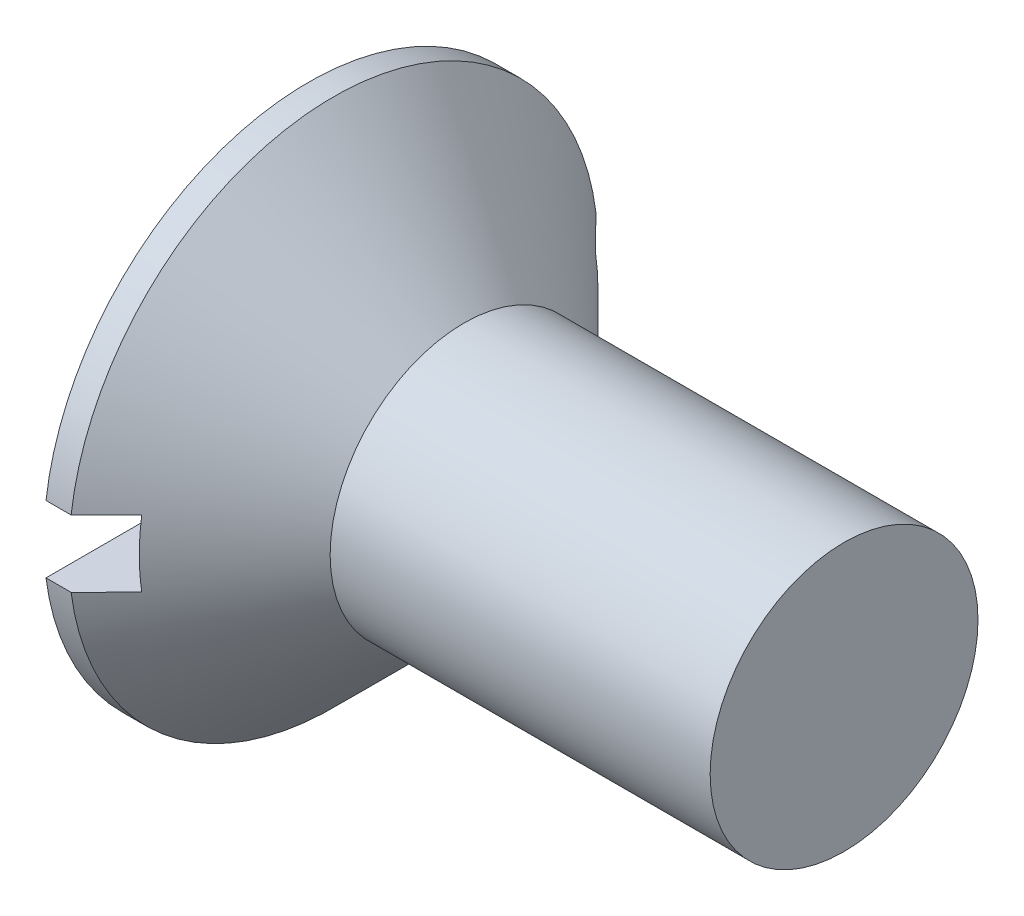
ISO-10303-21;
HEADER;
FILE_DESCRIPTION(('STEP AP214'),'2;1');
FILE_NAME('part.step','',(''),(''),'','','');
FILE_SCHEMA(('AUTOMOTIVE_DESIGN { 1 0 10303 214 1 1 1 1 }'));
ENDSEC;
DATA;
#1=APPLICATION_CONTEXT('core data for automotive mechanical design processes');
#2=APPLICATION_PROTOCOL_DEFINITION('international standard','automotive_design',2000,#1);
#3=PRODUCT_CONTEXT('',#1,'mechanical');
#4=PRODUCT('Part','Part','',(#3));
#5=PRODUCT_RELATED_PRODUCT_CATEGORY('part','',(#4));
#6=PRODUCT_DEFINITION_FORMATION('','',#4);
#7=PRODUCT_DEFINITION_CONTEXT('part definition',#1,'design');
#8=PRODUCT_DEFINITION('design','',#6,#7);
#9=PRODUCT_DEFINITION_SHAPE('','',#8);
#10=(LENGTH_UNIT() NAMED_UNIT(*) SI_UNIT(.MILLI.,.METRE.));
#11=(NAMED_UNIT(*) PLANE_ANGLE_UNIT() SI_UNIT($,.RADIAN.));
#12=(NAMED_UNIT(*) SI_UNIT($,.STERADIAN.) SOLID_ANGLE_UNIT());
#13=UNCERTAINTY_MEASURE_WITH_UNIT(LENGTH_MEASURE(1.E-05),#10,'distance_accuracy_value','');
#14=(GEOMETRIC_REPRESENTATION_CONTEXT(3) GLOBAL_UNCERTAINTY_ASSIGNED_CONTEXT((#13)) GLOBAL_UNIT_ASSIGNED_CONTEXT((#10,
#11,#12)) REPRESENTATION_CONTEXT('',''));
#15=CARTESIAN_POINT('',(0.,0.,0.));
#16=DIRECTION('',(0.,0.,1.));
#17=DIRECTION('',(1.,0.,0.));
#18=AXIS2_PLACEMENT_3D('',#15,#16,#17);
#19=CARTESIAN_POINT('',(0.,0.,0.));
#20=DIRECTION('',(1.,0.,0.));
#21=DIRECTION('',(0.,0.,-1.00000000000001));
#22=AXIS2_PLACEMENT_3D('',#19,#20,#21);
#23=PLANE('',#22);
#24=CARTESIAN_POINT('',(0.,0.,0.));
#25=DIRECTION('',(-1.,0.,0.));
#26=DIRECTION('',(0.,0.,1.00000000000001));
#27=AXIS2_PLACEMENT_3D('',#24,#25,#26);
#28=CIRCLE('',#27,7.9);
#29=CARTESIAN_POINT('',(1.07552855510562E-13,0.999999999999845,7.83645327938635));
#30=VERTEX_POINT('',#29);
#31=CARTESIAN_POINT('',(0.,0.99999999999999,-7.83645327938601));
#32=VERTEX_POINT('',#31);
#33=EDGE_CURVE('E122',#30,#32,#28,.T.);
#34=ORIENTED_EDGE('',*,*,#33,.T.);
#35=DIRECTION('',(0.,0.,1.00000000000001));
#36=VECTOR('',#35,1.);
#37=CARTESIAN_POINT('',(0.,0.999999999999925,1.31838984174237E-13));
#38=LINE('',#37,#36);
#39=EDGE_CURVE('E140',#32,#30,#38,.T.);
#40=ORIENTED_EDGE('',*,*,#39,.T.);
#41=EDGE_LOOP('',(#34,#40));
#42=FACE_BOUND('',#41,.T.);
#43=ADVANCED_FACE('F36',(#42),#23,.F.);
#44=CARTESIAN_POINT('',(-3.22858157710809,0.,0.));
#45=DIRECTION('',(-1.,0.,0.));
#46=DIRECTION('',(0.,0.,1.00000000000001));
#47=AXIS2_PLACEMENT_3D('',#44,#45,#46);
#48=CYLINDRICAL_SURFACE('',#47,7.9);
#49=CARTESIAN_POINT('',(0.750000000000001,0.,0.));
#50=DIRECTION('',(-1.,0.,0.));
#51=DIRECTION('',(0.,0.,1.00000000000001));
#52=AXIS2_PLACEMENT_3D('',#49,#50,#51);
#53=CIRCLE('',#52,7.9);
#54=CARTESIAN_POINT('',(0.74999999999999,-1.00000000000001,-7.83645327938595));
#55=VERTEX_POINT('',#54);
#56=CARTESIAN_POINT('',(0.750000000000108,-1.00000000000002,7.83645327938614));
#57=VERTEX_POINT('',#56);
#58=EDGE_CURVE('E114',#55,#57,#53,.T.);
#59=ORIENTED_EDGE('',*,*,#58,.T.);
#60=DIRECTION('',(-1.,0.,0.));
#61=VECTOR('',#60,1.);
#62=CARTESIAN_POINT('',(-3.22858157710808,-1.00000000000008,7.83645327938615));
#63=LINE('',#62,#61);
#64=CARTESIAN_POINT('',(1.07552855510562E-13,-1.00000000000002,7.83645327938614));
#65=VERTEX_POINT('',#64);
#66=EDGE_CURVE('E58',#57,#65,#63,.T.);
#67=ORIENTED_EDGE('',*,*,#66,.T.);
#68=CARTESIAN_POINT('',(0.,-1.00000000000001,-7.83645327938595));
#69=VERTEX_POINT('',#68);
#70=EDGE_CURVE('E124',#69,#65,#28,.T.);
#71=ORIENTED_EDGE('',*,*,#70,.F.);
#72=DIRECTION('',(-1.,0.,0.));
#73=VECTOR('',#72,1.);
#74=CARTESIAN_POINT('',(-3.2285815771081,-1.00000000000002,-7.83645327938595));
#75=LINE('',#74,#73);
#76=EDGE_CURVE('E145',#69,#55,#75,.F.);
#77=ORIENTED_EDGE('',*,*,#76,.T.);
#78=EDGE_LOOP('',(#59,#67,#71,#77));
#79=FACE_BOUND('',#78,.T.);
#80=ADVANCED_FACE('F157',(#79),#48,.T.);
#81=ORIENTED_EDGE('',*,*,#70,.T.);
#82=DIRECTION('',(0.,0.,-1.00000000000001));
#83=VECTOR('',#82,1.);
#84=CARTESIAN_POINT('',(1.07552855510562E-13,-1.,1.66533453693773E-13));
#85=LINE('',#84,#83);
#86=EDGE_CURVE('E147',#65,#69,#85,.T.);
#87=ORIENTED_EDGE('',*,*,#86,.T.);
#88=EDGE_LOOP('',(#81,#87));
#89=FACE_BOUND('',#88,.T.);
#90=ADVANCED_FACE('F38',(#89),#23,.F.);
#91=CARTESIAN_POINT('',(0.750000000000108,0.999999999999845,7.83645327938635));
#92=VERTEX_POINT('',#91);
#93=CARTESIAN_POINT('',(0.74999999999999,0.99999999999999,-7.83645327938601));
#94=VERTEX_POINT('',#93);
#95=EDGE_CURVE('E129',#92,#94,#53,.T.);
#96=ORIENTED_EDGE('',*,*,#95,.T.);
#97=DIRECTION('',(-1.,0.,0.));
#98=VECTOR('',#97,1.);
#99=CARTESIAN_POINT('',(-3.2285815771081,0.99999999999999,-7.83645327938601));
#100=LINE('',#99,#98);
#101=EDGE_CURVE('E142',#94,#32,#100,.T.);
#102=ORIENTED_EDGE('',*,*,#101,.T.);
#103=ORIENTED_EDGE('',*,*,#33,.F.);
#104=DIRECTION('',(-1.,0.,0.));
#105=VECTOR('',#104,1.);
#106=CARTESIAN_POINT('',(-3.22858157710798,0.999999999999921,7.83645327938636));
#107=LINE('',#106,#105);
#108=EDGE_CURVE('E138',#30,#92,#107,.F.);
#109=ORIENTED_EDGE('',*,*,#108,.T.);
#110=EDGE_LOOP('',(#96,#102,#103,#109));
#111=FACE_BOUND('',#110,.T.);
#112=ADVANCED_FACE('F155',(#111),#48,.T.);
#113=CARTESIAN_POINT('',(4.65,0.,0.));
#114=DIRECTION('',(-1.,0.,0.));
#115=DIRECTION('',(0.,0.,1.00000000000001));
#116=AXIS2_PLACEMENT_3D('',#113,#114,#115);
#117=CONICAL_SURFACE('',#116,4.,0.785398163397448);
#118=CARTESIAN_POINT('',(1.8,0.,0.));
#119=DIRECTION('',(1.,0.,0.));
#120=DIRECTION('',(0.,1.00000000000002,0.));
#121=AXIS2_PLACEMENT_3D('',#118,#119,#120);
#122=CIRCLE('',#121,6.85);
#123=CARTESIAN_POINT('',(1.8,-1.,-6.77661419884587));
#124=VERTEX_POINT('',#123);
#125=CARTESIAN_POINT('',(1.8,1.00000000000002,-6.77661419884588));
#126=VERTEX_POINT('',#125);
#127=EDGE_CURVE('E51',#124,#126,#122,.T.);
#128=ORIENTED_EDGE('',*,*,#127,.T.);
#129=CARTESIAN_POINT('',(-8.75111048268514,0.99999999999999,17.3723529215428));
#130=CARTESIAN_POINT('',(-8.16144224495191,0.99999999999999,16.7817012338804));
#131=CARTESIAN_POINT('',(-7.57181679409338,0.999999999999989,16.1910068100643));
#132=CARTESIAN_POINT('',(-6.39269800938796,0.999999999999988,15.0094721269609));
#133=CARTESIAN_POINT('',(-5.80320467719195,0.999999999999987,14.4186318660262));
#134=CARTESIAN_POINT('',(-4.62425427261055,0.999999999999987,13.2366023548547));
#135=CARTESIAN_POINT('',(-4.03479725135443,0.999999999999986,12.6454130536151));
#136=CARTESIAN_POINT('',(-2.85618266385658,0.999999999999985,11.4627496565458));
#137=CARTESIAN_POINT('',(-2.26702509422704,0.999999999999984,10.8712755640925));
#138=CARTESIAN_POINT('',(-1.06840913198528,0.999999999999983,9.66700955329708));
#139=CARTESIAN_POINT('',(-0.458967260785589,0.999999999999983,9.05420118301458));
#140=CARTESIAN_POINT('',(0.454532222825595,0.999999999999982,8.1343077388035));
#141=CARTESIAN_POINT('',(0.758927003110809,0.999999999999981,7.82755754816286));
#142=CARTESIAN_POINT('',(1.36739261118857,0.999999999999981,7.21373815557743));
#143=CARTESIAN_POINT('',(1.67146344012798,0.999999999999981,6.90666895476967));
#144=CARTESIAN_POINT('',(2.27908236392702,0.99999999999998,6.2921161152463));
#145=CARTESIAN_POINT('',(2.58263053845717,0.999999999999979,5.98463255535697));
#146=CARTESIAN_POINT('',(3.18899261007889,0.99999999999998,5.36893396929874));
#147=CARTESIAN_POINT('',(3.49180649709191,0.999999999999983,5.06071893320347));
#148=CARTESIAN_POINT('',(4.09619822396069,0.999999999999974,4.44311462398919));
#149=CARTESIAN_POINT('',(4.39777614184049,0.999999999999962,4.13372542744331));
#150=CARTESIAN_POINT('',(4.84838109277027,0.999999999999985,3.66794267828143));
#151=CARTESIAN_POINT('',(4.99828746848486,1.,3.51240030320817));
#152=CARTESIAN_POINT('',(5.2972295071079,0.999999999999955,3.20048152496961));
#153=CARTESIAN_POINT('',(5.44626517758961,0.999999999999895,3.04410512908119));
#154=CARTESIAN_POINT('',(5.63452019031248,0.99999999999995,2.84487341796281));
#155=CARTESIAN_POINT('',(5.67436438858135,0.999999999999969,2.80260845226597));
#156=CARTESIAN_POINT('',(5.7539398914092,0.999999999999984,2.71797219006638));
#157=CARTESIAN_POINT('',(5.79367119571338,0.999999999999979,2.67560089332404));
#158=CARTESIAN_POINT('',(5.91267399890453,0.999999999999971,2.54830598388808));
#159=CARTESIAN_POINT('',(5.99175330410761,0.999999999999972,2.46320249752469));
#160=CARTESIAN_POINT('',(6.1489582397943,0.999999999999981,2.29266307557925));
#161=CARTESIAN_POINT('',(6.22708622766774,0.999999999999988,2.20722931905867));
#162=CARTESIAN_POINT('',(6.38240183057305,0.999999999999964,2.03551770123204));
#163=CARTESIAN_POINT('',(6.45958947879937,0.999999999999932,1.94923986991724));
#164=CARTESIAN_POINT('',(6.6386237698956,0.999999999999914,1.74605972009377));
#165=CARTESIAN_POINT('',(6.73995381200676,0.999999999999947,1.62869639305075));
#166=CARTESIAN_POINT('',(6.88917519252372,0.99999999999999,1.44968131693157));
#167=CARTESIAN_POINT('',(6.938606899626,1.,1.3893168346165));
#168=CARTESIAN_POINT('',(7.03600057631057,0.999999999999948,1.26741714506481));
#169=CARTESIAN_POINT('',(7.08396269678783,0.999999999999879,1.20588205908281));
#170=CARTESIAN_POINT('',(7.1784042551802,0.999999999999879,1.08042827136698));
#171=CARTESIAN_POINT('',(7.22485668078559,0.999999999999949,1.01648908913458));
#172=CARTESIAN_POINT('',(7.31461514560344,1.,0.886276219999968));
#173=CARTESIAN_POINT('',(7.35791688740962,0.999999999999982,0.819999521100189));
#174=CARTESIAN_POINT('',(7.43909029004803,0.999999999999967,0.684983207333312));
#175=CARTESIAN_POINT('',(7.47700827738964,0.999999999999971,0.616271888635362));
#176=CARTESIAN_POINT('',(7.5446644467034,0.999999999999978,0.47495464455035));
#177=CARTESIAN_POINT('',(7.57442800697369,0.999999999999982,0.402361662506173));
#178=CARTESIAN_POINT('',(7.60828605986784,0.999999999999979,0.293622142922142));
#179=CARTESIAN_POINT('',(7.61754278768115,0.999999999999977,0.25909114505043));
#180=CARTESIAN_POINT('',(7.63280808195745,0.999999999999971,0.189307737917459));
#181=CARTESIAN_POINT('',(7.63881713950401,0.999999999999968,0.15405543856209));
#182=CARTESIAN_POINT('',(7.64714790586476,0.999999999999979,0.0832984083006169));
#183=CARTESIAN_POINT('',(7.64948896554468,0.999999999999993,0.0477960014965256));
#184=CARTESIAN_POINT('',(7.65036050339176,0.999999999999954,-0.0232573195438609));
#185=CARTESIAN_POINT('',(7.64889094055609,0.9999999999999,-0.0588082342979944));
#186=CARTESIAN_POINT('',(7.64227381399178,0.999999999999901,-0.129391283773637));
#187=CARTESIAN_POINT('',(7.63714337869394,0.999999999999954,-0.164425061814244));
#188=CARTESIAN_POINT('',(7.62358602557578,0.999999999999992,-0.23385193271585));
#189=CARTESIAN_POINT('',(7.61515765736175,0.999999999999976,-0.26824473670217));
#190=CARTESIAN_POINT('',(7.59543017486798,0.99999999999997,-0.336439707723722));
#191=CARTESIAN_POINT('',(7.58411176460614,0.999999999999979,-0.370236204747931));
#192=CARTESIAN_POINT('',(7.55914708298644,0.999999999999967,-0.436939365687489));
#193=CARTESIAN_POINT('',(7.54550116225841,0.999999999999945,-0.469846162768686));
#194=CARTESIAN_POINT('',(7.50536219669924,0.999999999999927,-0.559280194075011));
#195=CARTESIAN_POINT('',(7.47693282128606,0.99999999999996,-0.614934514191874));
#196=CARTESIAN_POINT('',(7.41619685900515,0.999999999999985,-0.724104222688096));
#197=CARTESIAN_POINT('',(7.3838860325856,0.999999999999975,-0.777617185554004));
#198=CARTESIAN_POINT('',(7.31649651100038,0.999999999999969,-0.883108836541741));
#199=CARTESIAN_POINT('',(7.28140888252926,0.999999999999971,-0.935081766813651));
#200=CARTESIAN_POINT('',(7.20934259617385,0.999999999999973,-1.03770237134481));
#201=CARTESIAN_POINT('',(7.1723635731699,0.999999999999972,-1.08834978684895));
#202=CARTESIAN_POINT('',(7.09668756377589,0.999999999999971,-1.18907223755568));
#203=CARTESIAN_POINT('',(7.05797787678311,0.999999999999971,-1.23913768340023));
#204=CARTESIAN_POINT('',(6.97951546547231,0.999999999999971,-1.33844833687462));
#205=CARTESIAN_POINT('',(6.93976264948154,0.999999999999972,-1.3876934717876));
#206=CARTESIAN_POINT('',(6.85955804419442,0.99999999999997,-1.48541557793774));
#207=CARTESIAN_POINT('',(6.81910812141697,0.999999999999967,-1.53389408506544));
#208=CARTESIAN_POINT('',(6.73759257566203,0.999999999999974,-1.63032614618768));
#209=CARTESIAN_POINT('',(6.69652697774345,0.999999999999984,-1.67827972141103));
#210=CARTESIAN_POINT('',(6.57434405385389,0.999999999999994,-1.81949375555138));
#211=CARTESIAN_POINT('',(6.49253777102532,0.999999999999976,-1.91215770302953));
#212=CARTESIAN_POINT('',(6.32768810256273,0.999999999999963,-2.09638021295081));
#213=CARTESIAN_POINT('',(6.24464466214777,0.999999999999967,-2.18793872611874));
#214=CARTESIAN_POINT('',(6.07767736659286,0.999999999999971,-2.370271227974));
#215=CARTESIAN_POINT('',(5.99375339367504,0.999999999999969,-2.46104510867123));
#216=CARTESIAN_POINT('',(5.8252708659291,0.999999999999968,-2.64200251669864));
#217=CARTESIAN_POINT('',(5.74071230551223,0.999999999999968,-2.73218603881647));
#218=CARTESIAN_POINT('',(5.4861316388928,0.999999999999968,-3.00228581399741));
#219=CARTESIAN_POINT('',(5.31540328584025,0.999999999999967,-3.18153596104206));
#220=CARTESIAN_POINT('',(4.97283523027718,0.999999999999966,-3.5389401467443));
#221=CARTESIAN_POINT('',(4.80099561775687,0.999999999999966,-3.71709427193361));
#222=CARTESIAN_POINT('',(4.45832154023981,0.999999999999965,-4.07088240821385));
#223=CARTESIAN_POINT('',(4.28749454529666,0.999999999999965,-4.24652365827113));
#224=CARTESIAN_POINT('',(3.94533540474472,0.999999999999963,-4.5973201166138));
#225=CARTESIAN_POINT('',(3.77400324873452,0.999999999999962,-4.77247531474503));
#226=CARTESIAN_POINT('',(3.25964190551176,0.999999999999966,-5.29724637133376));
#227=CARTESIAN_POINT('',(2.91608021829216,0.999999999999981,-5.64634010483317));
#228=CARTESIAN_POINT('',(2.1068567584288,0.999999999999987,-6.4667381225843));
#229=CARTESIAN_POINT('',(1.64086835816068,0.999999999999966,-6.93771982623414));
#230=CARTESIAN_POINT('',(0.708118272101816,0.999999999999949,-7.8789194952222));
#231=CARTESIAN_POINT('',(0.241356583769341,0.999999999999954,-8.34913745803997));
#232=CARTESIAN_POINT('',(-0.692730625460433,0.999999999999955,-9.28920941360574));
#233=CARTESIAN_POINT('',(-1.16005624428106,0.999999999999953,-9.75906330902656));
#234=CARTESIAN_POINT('',(-2.09500849239945,0.99999999999995,-10.6984704213426));
#235=CARTESIAN_POINT('',(-2.56263512136168,0.999999999999949,-11.1680236385718));
#236=CARTESIAN_POINT('',(-3.98334366363007,0.999999999999947,-12.593974439585));
#237=CARTESIAN_POINT('',(-4.9367424196597,0.999999999999946,-13.5500563183113));
#238=CARTESIAN_POINT('',(-6.36705466579657,0.999999999999939,-14.9837557450105));
#239=CARTESIAN_POINT('',(-6.84380866332769,0.999999999999936,-15.4615324747223));
#240=CARTESIAN_POINT('',(-7.79740134857238,0.999999999999941,-16.4170010082393));
#241=CARTESIAN_POINT('',(-8.27424003625006,0.999999999999951,-16.8946928120804));
#242=CARTESIAN_POINT('',(-8.7511104826849,0.999999999999973,-17.3723529215423));
#243=B_SPLINE_CURVE_WITH_KNOTS('',3,(#129,#130,#131,#132,#133,#134,#135,#136,#137,#138,#139,
#140,#141,#142,#143,#144,#145,#146,#147,#148,#149,#150,#151,#152,#153,#154,#155,#156,#157,#158,
#159,#160,#161,#162,#163,#164,#165,#166,#167,#168,#169,#170,#171,#172,#173,#174,#175,#176,#177,
#178,#179,#180,#181,#182,#183,#184,#185,#186,#187,#188,#189,#190,#191,#192,#193,#194,#195,#196,
#197,#198,#199,#200,#201,#202,#203,#204,#205,#206,#207,#208,#209,#210,#211,#212,#213,#214,#215,
#216,#217,#218,#219,#220,#221,#222,#223,#224,#225,#226,#227,#228,#229,#230,#231,#232,#233,#234,
#235,#236,#237,#238,#239,#240,#241,#242),.UNSPECIFIED.,.F.,.F.,(4,2,2,2,2,2,2,2,2,2,2,2,2,2,2,2,
2,2,2,2,2,2,2,2,2,2,2,2,2,2,2,2,2,2,2,2,2,2,2,2,2,2,2,2,2,2,2,2,2,2,2,2,2,2,2,2,4),(0.,
2.50383755724038,5.00770482803633,7.51223650824819,10.0167391934141,12.6095327120228,
13.9059764267842,15.2024155365041,16.4986355078513,17.794873171067,19.0910277047169,
19.7390908795515,20.3871484092153,20.5614037586538,20.7356595010722,21.0841757171254,
21.4314823024859,21.7787765920226,22.2438728574652,22.4779222223597,22.7119474743278,
22.9489834157771,23.1863368287491,23.4215048062615,23.6559323555037,23.7630547362442,
23.8701609143635,23.9767001180704,24.0832404681586,24.1892855801903,24.2953773821798,
24.4021969469652,24.5090004340141,24.6962296363362,24.883665233442,25.0717304703324,
25.2598321498577,25.4496689454166,25.6395224805462,25.8289289177426,26.0183276666284,
26.3891315344037,26.7599518703444,27.1308224551965,27.501696310109,28.2443230112183,
28.9868903089778,29.7219298404617,30.4569846138102,31.9263727667959,33.9140132618934,
35.9016603032082,37.8897253054991,39.8777880955948,43.9284118600559,45.9532784749723,
47.9781442336095),.UNSPECIFIED.);
#244=EDGE_CURVE('E11',#126,#94,#243,.T.);
#245=ORIENTED_EDGE('',*,*,#244,.T.);
#246=ORIENTED_EDGE('',*,*,#95,.F.);
#247=CARTESIAN_POINT('',(1.8000000000001,0.999999999999942,6.77661419884607));
#248=VERTEX_POINT('',#247);
#249=EDGE_CURVE('E40',#92,#248,#243,.T.);
#250=ORIENTED_EDGE('',*,*,#249,.T.);
#251=CARTESIAN_POINT('',(1.8000000000001,-1.00000000000001,6.77661419884592));
#252=VERTEX_POINT('',#251);
#253=EDGE_CURVE('E105',#248,#252,#122,.T.);
#254=ORIENTED_EDGE('',*,*,#253,.T.);
#255=CARTESIAN_POINT('',(-8.75111048268492,-1.00000000000004,-17.3723529215423));
#256=CARTESIAN_POINT('',(-8.16144224495161,-1.00000000000004,-16.78170123388));
#257=CARTESIAN_POINT('',(-7.57181679409306,-1.00000000000004,-16.1910068100639));
#258=CARTESIAN_POINT('',(-6.39269800938762,-1.00000000000004,-15.0094721269606));
#259=CARTESIAN_POINT('',(-5.80320467719163,-1.00000000000004,-14.4186318660258));
#260=CARTESIAN_POINT('',(-4.62425427261024,-1.00000000000003,-13.2366023548544));
#261=CARTESIAN_POINT('',(-4.03479725135414,-1.00000000000003,-12.6454130536147));
#262=CARTESIAN_POINT('',(-2.8561826638563,-1.00000000000003,-11.4627496565455));
#263=CARTESIAN_POINT('',(-2.26702509422677,-1.00000000000003,-10.8712755640922));
#264=CARTESIAN_POINT('',(-1.06840913198503,-1.00000000000002,-9.66700955329682));
#265=CARTESIAN_POINT('',(-0.458967260785346,-1.00000000000002,-9.05420118301433));
#266=CARTESIAN_POINT('',(0.454532222825824,-1.00000000000002,-8.13430773880327));
#267=CARTESIAN_POINT('',(0.758927003111032,-1.00000000000002,-7.82755754816263));
#268=CARTESIAN_POINT('',(1.36739261118878,-1.00000000000002,-7.21373815557721));
#269=CARTESIAN_POINT('',(1.67146344012819,-1.00000000000002,-6.90666895476945));
#270=CARTESIAN_POINT('',(2.27908236392722,-1.00000000000002,-6.2921161152461));
#271=CARTESIAN_POINT('',(2.58263053845736,-1.00000000000002,-5.98463255535677));
#272=CARTESIAN_POINT('',(3.18899261007909,-1.00000000000001,-5.36893396929855));
#273=CARTESIAN_POINT('',(3.4918064970921,-1.00000000000001,-5.06071893320329));
#274=CARTESIAN_POINT('',(4.09619822396086,-1.00000000000002,-4.443114623989));
#275=CARTESIAN_POINT('',(4.39777614184064,-1.00000000000003,-4.1337254274431));
#276=CARTESIAN_POINT('',(4.84838109277046,-1.,-3.66794267828127));
#277=CARTESIAN_POINT('',(4.99828746848507,-0.999999999999984,-3.51240030320803));
#278=CARTESIAN_POINT('',(5.29722950710803,-1.00000000000004,-3.2004815249694));
#279=CARTESIAN_POINT('',(5.44626517758964,-1.00000000000011,-3.04410512908088));
#280=CARTESIAN_POINT('',(5.6345201903126,-1.00000000000004,-2.84487341796259));
#281=CARTESIAN_POINT('',(5.6743643885815,-1.00000000000002,-2.80260845226579));
#282=CARTESIAN_POINT('',(5.75393989140938,-1.,-2.71797219006622));
#283=CARTESIAN_POINT('',(5.79367119571355,-1.00000000000001,-2.67560089332387));
#284=CARTESIAN_POINT('',(5.91267399890469,-1.00000000000002,-2.54830598388789));
#285=CARTESIAN_POINT('',(5.99175330410777,-1.00000000000001,-2.46320249752451));
#286=CARTESIAN_POINT('',(6.14895823979448,-1.,-2.29266307557907));
#287=CARTESIAN_POINT('',(6.22708622766793,-1.,-2.2072293190585));
#288=CARTESIAN_POINT('',(6.3824018305732,-1.00000000000002,-2.03551770123184));
#289=CARTESIAN_POINT('',(6.45958947879948,-1.00000000000004,-1.949239869917));
#290=CARTESIAN_POINT('',(6.6386237698957,-1.00000000000005,-1.7460597200935));
#291=CARTESIAN_POINT('',(6.73995381200691,-1.00000000000003,-1.62869639305053));
#292=CARTESIAN_POINT('',(6.88917519252391,-0.999999999999997,-1.44968131693138));
#293=CARTESIAN_POINT('',(6.93860689962619,-0.999999999999988,-1.3893168346163));
#294=CARTESIAN_POINT('',(7.03600057631072,-1.00000000000002,-1.26741714506458));
#295=CARTESIAN_POINT('',(7.08396269678793,-1.00000000000007,-1.20588205908254));
#296=CARTESIAN_POINT('',(7.1784042551803,-1.00000000000007,-1.0804282713667));
#297=CARTESIAN_POINT('',(7.22485668078574,-1.00000000000002,-1.01648908913433));
#298=CARTESIAN_POINT('',(7.31461514560363,-0.999999999999992,-0.886276219999729));
#299=CARTESIAN_POINT('',(7.35791688740979,-1.00000000000001,-0.819999521099931));
#300=CARTESIAN_POINT('',(7.43909029004818,-0.999999999999997,-0.684983207333023));
#301=CARTESIAN_POINT('',(7.47700827738979,-0.99999999999996,-0.616271888635062));
#302=CARTESIAN_POINT('',(7.54466444670354,-1.00000000000005,-0.474954644550029));
#303=CARTESIAN_POINT('',(7.57442800697383,-1.00000000000018,-0.402361662505845));
#304=CARTESIAN_POINT('',(7.60828605986793,-1.00000000000009,-0.293622142921814));
#305=CARTESIAN_POINT('',(7.61754278768122,-1.00000000000003,-0.259091145050115));
#306=CARTESIAN_POINT('',(7.63280808195749,-0.999999999999981,-0.189307737917167));
#307=CARTESIAN_POINT('',(7.63881713950405,-0.999999999999999,-0.154055438561809));
#308=CARTESIAN_POINT('',(7.64714790586476,-1.00000000000001,-0.0832984083003596));
#309=CARTESIAN_POINT('',(7.64948896554465,-1.,-0.0477960014962827));
#310=CARTESIAN_POINT('',(7.65036050339178,-1.00000000000001,0.0232573195440767));
#311=CARTESIAN_POINT('',(7.6488909405562,-1.00000000000002,0.0588082342981973));
#312=CARTESIAN_POINT('',(7.64227381399188,-1.00000000000002,0.129391283773811));
#313=CARTESIAN_POINT('',(7.63714337869393,-1.00000000000001,0.164425061814402));
#314=CARTESIAN_POINT('',(7.6235860255757,-0.999999999999998,0.233851932715996));
#315=CARTESIAN_POINT('',(7.6151576573617,-1.,0.268244736702319));
#316=CARTESIAN_POINT('',(7.59543017486792,-1.00000000000001,0.336439707723864));
#317=CARTESIAN_POINT('',(7.58411176460604,-1.00000000000001,0.37023620474806));
#318=CARTESIAN_POINT('',(7.5591470829864,-0.999999999999999,0.436939365687644));
#319=CARTESIAN_POINT('',(7.54550116225848,-0.99999999999999,0.46984616276888));
#320=CARTESIAN_POINT('',(7.50536219669941,-0.999999999999982,0.559280194075215));
#321=CARTESIAN_POINT('',(7.47693282128606,-0.999999999999997,0.61493451419198));
#322=CARTESIAN_POINT('',(7.41619685900503,-1.00000000000001,0.724104222688119));
#323=CARTESIAN_POINT('',(7.38388603258553,-1.,0.777617185554041));
#324=CARTESIAN_POINT('',(7.31649651100035,-1.,0.883108836541787));
#325=CARTESIAN_POINT('',(7.28140888252922,-1.,0.935081766813691));
#326=CARTESIAN_POINT('',(7.2093425961738,-1.,1.03770237134485));
#327=CARTESIAN_POINT('',(7.17236357316984,-1.,1.08834978684899));
#328=CARTESIAN_POINT('',(7.09668756377584,-1.,1.18907223755572));
#329=CARTESIAN_POINT('',(7.05797787678306,-1.,1.23913768340027));
#330=CARTESIAN_POINT('',(6.97951546547225,-1.,1.33844833687467));
#331=CARTESIAN_POINT('',(6.93976264948149,-1.,1.38769347178765));
#332=CARTESIAN_POINT('',(6.85955804419436,-1.,1.48541557793777));
#333=CARTESIAN_POINT('',(6.81910812141689,-1.,1.53389408506545));
#334=CARTESIAN_POINT('',(6.73759257566202,-1.,1.63032614618772));
#335=CARTESIAN_POINT('',(6.69652697774352,-0.999999999999996,1.67827972141113));
#336=CARTESIAN_POINT('',(6.57434405385404,-0.999999999999991,1.81949375555154));
#337=CARTESIAN_POINT('',(6.49253777102535,-0.999999999999999,1.91215770302957));
#338=CARTESIAN_POINT('',(6.32768810256266,-1.,2.09638021295077));
#339=CARTESIAN_POINT('',(6.24464466214774,-1.,2.18793872611872));
#340=CARTESIAN_POINT('',(6.07767736659286,-1.,2.37027122797401));
#341=CARTESIAN_POINT('',(5.99375339367503,-1.,2.46104510867122));
#342=CARTESIAN_POINT('',(5.82527086592908,-1.,2.64200251669863));
#343=CARTESIAN_POINT('',(5.74071230551221,-1.,2.73218603881647));
#344=CARTESIAN_POINT('',(5.48613163889278,-1.,3.00228581399742));
#345=CARTESIAN_POINT('',(5.31540328584022,-1.,3.18153596104207));
#346=CARTESIAN_POINT('',(4.97283523027713,-1.,3.53894014674433));
#347=CARTESIAN_POINT('',(4.80099561775681,-1.,3.71709427193365));
#348=CARTESIAN_POINT('',(4.45832154023974,-1.,4.0708824082139));
#349=CARTESIAN_POINT('',(4.28749454529659,-1.,4.2465236582712));
#350=CARTESIAN_POINT('',(3.94533540474463,-0.999999999999997,4.59732011661386));
#351=CARTESIAN_POINT('',(3.77400324873441,-0.999999999999993,4.77247531474509));
#352=CARTESIAN_POINT('',(3.25964190551169,-1.00000000000001,5.29724637133389));
#353=CARTESIAN_POINT('',(2.91608021829223,-1.00000000000006,5.64634010483343));
#354=CARTESIAN_POINT('',(2.10685675842891,-1.00000000000008,6.46673812258466));
#355=CARTESIAN_POINT('',(1.6408683581606,-1.00000000000002,6.93771982623434));
#356=CARTESIAN_POINT('',(0.708118272101569,-0.999999999999973,7.87891949522232));
#357=CARTESIAN_POINT('',(0.241356583769123,-0.999999999999989,8.34913745804016));
#358=CARTESIAN_POINT('',(-0.692730625460661,-1.,9.289209413606));
#359=CARTESIAN_POINT('',(-1.16005624428132,-0.999999999999996,9.75906330902684));
#360=CARTESIAN_POINT('',(-2.09500849239977,-0.999999999999991,10.6984704213429));
#361=CARTESIAN_POINT('',(-2.56263512136202,-0.999999999999992,11.1680236385722));
#362=CARTESIAN_POINT('',(-3.98334366363048,-0.999999999999994,12.5939744395854));
#363=CARTESIAN_POINT('',(-4.93674241966015,-0.999999999999999,13.5500563183118));
#364=CARTESIAN_POINT('',(-6.36705466579711,-0.999999999999985,14.9837557450111));
#365=CARTESIAN_POINT('',(-6.84380866332827,-0.999999999999978,15.4615324747228));
#366=CARTESIAN_POINT('',(-7.79740134857296,-0.999999999999999,16.4170010082399));
#367=CARTESIAN_POINT('',(-8.2742400362506,-1.00000000000003,16.8946928120811));
#368=CARTESIAN_POINT('',(-8.75111048268533,-1.0000000000001,17.3723529215431));
#369=B_SPLINE_CURVE_WITH_KNOTS('',3,(#255,#256,#257,#258,#259,#260,#261,#262,#263,#264,#265,
#266,#267,#268,#269,#270,#271,#272,#273,#274,#275,#276,#277,#278,#279,#280,#281,#282,#283,#284,
#285,#286,#287,#288,#289,#290,#291,#292,#293,#294,#295,#296,#297,#298,#299,#300,#301,#302,#303,
#304,#305,#306,#307,#308,#309,#310,#311,#312,#313,#314,#315,#316,#317,#318,#319,#320,#321,#322,
#323,#324,#325,#326,#327,#328,#329,#330,#331,#332,#333,#334,#335,#336,#337,#338,#339,#340,#341,
#342,#343,#344,#345,#346,#347,#348,#349,#350,#351,#352,#353,#354,#355,#356,#357,#358,#359,#360,
#361,#362,#363,#364,#365,#366,#367,#368),.UNSPECIFIED.,.F.,.F.,(4,2,2,2,2,2,2,2,2,2,2,2,2,2,2,2,
2,2,2,2,2,2,2,2,2,2,2,2,2,2,2,2,2,2,2,2,2,2,2,2,2,2,2,2,2,2,2,2,2,2,2,2,2,2,2,2,4),(0.,
2.50383755724036,5.00770482803628,7.5122365082481,10.016739193414,12.6095327120226,
13.905976426784,15.2024155365039,16.4986355078511,17.7948731710668,19.0910277047167,
19.7390908795512,20.3871484092151,20.5614037586536,20.7356595010719,21.0841757171252,
21.4314823024856,21.7787765920224,22.243872857465,22.4779222223595,22.7119474743275,
22.9489834157769,23.1863368287489,23.4215048062614,23.6559323555035,23.763054736244,
23.8701609143633,23.9767001180702,24.0832404681582,24.18928558019,24.2953773821795,
24.4021969469649,24.5090004340137,24.6962296363358,24.8836652334416,25.071730470332,
25.2598321498573,25.4496689454162,25.6395224805458,25.8289289177421,26.0183276666279,
26.3891315344032,26.7599518703439,27.130822455196,27.5016963101085,28.2443230112179,
28.9868903089774,29.7219298404613,30.4569846138098,31.9263727667956,33.9140132618932,
35.901660303208,37.889725305499,39.8777880955948,43.9284118600561,45.9532784749726,
47.97814423361),.UNSPECIFIED.);
#370=EDGE_CURVE('E108',#252,#57,#369,.T.);
#371=ORIENTED_EDGE('',*,*,#370,.T.);
#372=ORIENTED_EDGE('',*,*,#58,.F.);
#373=EDGE_CURVE('E104',#55,#124,#369,.T.);
#374=ORIENTED_EDGE('',*,*,#373,.T.);
#375=EDGE_LOOP('',(#128,#245,#246,#250,#254,#371,#372,#374));
#376=FACE_BOUND('',#375,.T.);
#377=CARTESIAN_POINT('',(4.65,0.,0.));
#378=DIRECTION('',(-1.,0.,0.));
#379=DIRECTION('',(0.,0.,1.00000000000001));
#380=AXIS2_PLACEMENT_3D('',#377,#378,#379);
#381=CIRCLE('',#380,4.);
#382=CARTESIAN_POINT('',(4.65,0.,4.00000000000002));
#383=VERTEX_POINT('',#382);
#384=EDGE_CURVE('E132',#383,#383,#381,.T.);
#385=ORIENTED_EDGE('',*,*,#384,.T.);
#386=EDGE_LOOP('',(#385));
#387=FACE_BOUND('',#386,.T.);
#388=ADVANCED_FACE('F111',(#376,#387),#117,.T.);
#389=CARTESIAN_POINT('',(-3.22858157710809,0.,0.));
#390=DIRECTION('',(-1.,0.,0.));
#391=DIRECTION('',(0.,0.,1.00000000000001));
#392=AXIS2_PLACEMENT_3D('',#389,#390,#391);
#393=CYLINDRICAL_SURFACE('',#392,4.);
#394=ORIENTED_EDGE('',*,*,#384,.F.);
#395=EDGE_LOOP('',(#394));
#396=FACE_BOUND('',#395,.T.);
#397=CARTESIAN_POINT('',(16.,0.,0.));
#398=DIRECTION('',(-1.,0.,0.));
#399=DIRECTION('',(0.,0.,1.00000000000001));
#400=AXIS2_PLACEMENT_3D('',#397,#398,#399);
#401=CIRCLE('',#400,4.);
#402=CARTESIAN_POINT('',(16.,0.,4.00000000000002));
#403=VERTEX_POINT('',#402);
#404=EDGE_CURVE('E135',#403,#403,#401,.T.);
#405=ORIENTED_EDGE('',*,*,#404,.T.);
#406=EDGE_LOOP('',(#405));
#407=FACE_BOUND('',#406,.T.);
#408=ADVANCED_FACE('F171',(#396,#407),#393,.T.);
#409=CARTESIAN_POINT('',(16.,4.00000000000002,0.));
#410=DIRECTION('',(-1.,0.,0.));
#411=DIRECTION('',(0.,0.,1.00000000000001));
#412=AXIS2_PLACEMENT_3D('',#409,#410,#411);
#413=PLANE('',#412);
#414=ORIENTED_EDGE('',*,*,#404,.F.);
#415=EDGE_LOOP('',(#414));
#416=FACE_BOUND('',#415,.T.);
#417=ADVANCED_FACE('F177',(#416),#413,.F.);
#418=CARTESIAN_POINT('',(-0.489640130745091,0.999999999999956,-7.89999999999985));
#419=DIRECTION('',(0.,1.00000000000002,0.));
#420=DIRECTION('',(0.,0.,1.00000000000001));
#421=AXIS2_PLACEMENT_3D('',#418,#419,#420);
#422=PLANE('',#421);
#423=ORIENTED_EDGE('',*,*,#108,.F.);
#424=ORIENTED_EDGE('',*,*,#39,.F.);
#425=ORIENTED_EDGE('',*,*,#101,.F.);
#426=ORIENTED_EDGE('',*,*,#244,.F.);
#427=DIRECTION('',(0.,0.,1.00000000000001));
#428=VECTOR('',#427,1.);
#429=CARTESIAN_POINT('',(1.8,0.999999999999949,-7.89999999999993));
#430=LINE('',#429,#428);
#431=EDGE_CURVE('E101',#126,#248,#430,.T.);
#432=ORIENTED_EDGE('',*,*,#431,.T.);
#433=ORIENTED_EDGE('',*,*,#249,.F.);
#434=EDGE_LOOP('',(#423,#424,#425,#426,#432,#433));
#435=FACE_BOUND('',#434,.T.);
#436=ADVANCED_FACE('F151',(#435),#422,.F.);
#437=CARTESIAN_POINT('',(1.8,-1.,-7.89999999999998));
#438=DIRECTION('',(1.,0.,0.));
#439=DIRECTION('',(0.,1.00000000000002,0.));
#440=AXIS2_PLACEMENT_3D('',#437,#438,#439);
#441=PLANE('',#440);
#442=ORIENTED_EDGE('',*,*,#431,.F.);
#443=ORIENTED_EDGE('',*,*,#127,.F.);
#444=DIRECTION('',(0.,0.,1.00000000000001));
#445=VECTOR('',#444,1.);
#446=CARTESIAN_POINT('',(1.8,-1.,-7.89999999999998));
#447=LINE('',#446,#445);
#448=EDGE_CURVE('E99',#124,#252,#447,.T.);
#449=ORIENTED_EDGE('',*,*,#448,.T.);
#450=ORIENTED_EDGE('',*,*,#253,.F.);
#451=EDGE_LOOP('',(#442,#443,#449,#450));
#452=FACE_BOUND('',#451,.T.);
#453=ADVANCED_FACE('F98',(#452),#441,.F.);
#454=CARTESIAN_POINT('',(-0.489640130745091,-1.00000000000002,-7.89999999999993));
#455=DIRECTION('',(0.,-1.00000000000002,0.));
#456=DIRECTION('',(0.,0.,-1.00000000000001));
#457=AXIS2_PLACEMENT_3D('',#454,#455,#456);
#458=PLANE('',#457);
#459=ORIENTED_EDGE('',*,*,#76,.F.);
#460=ORIENTED_EDGE('',*,*,#86,.F.);
#461=ORIENTED_EDGE('',*,*,#66,.F.);
#462=ORIENTED_EDGE('',*,*,#370,.F.);
#463=ORIENTED_EDGE('',*,*,#448,.F.);
#464=ORIENTED_EDGE('',*,*,#373,.F.);
#465=EDGE_LOOP('',(#459,#460,#461,#462,#463,#464));
#466=FACE_BOUND('',#465,.T.);
#467=ADVANCED_FACE('F106',(#466),#458,.F.);
#468=CLOSED_SHELL('',(#43,#80,#90,#112,#388,#408,#417,#436,#453,#467));
#469=MANIFOLD_SOLID_BREP('B2',#468);
#470=ADVANCED_BREP_SHAPE_REPRESENTATION('',(#18,#469),#14);
#471=SHAPE_DEFINITION_REPRESENTATION(#9,#470);
ENDSEC;
END-ISO-10303-21;
